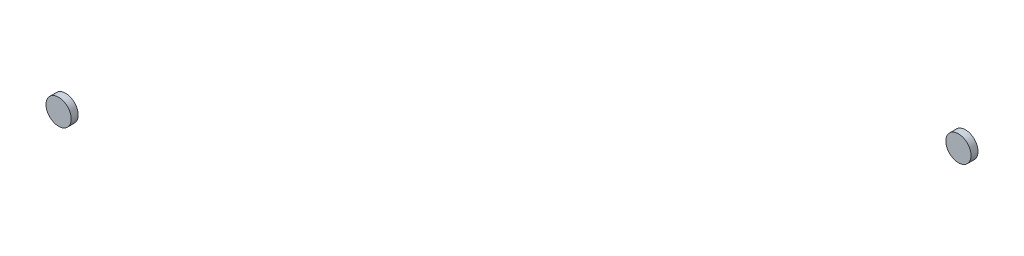
ISO-10303-21;
HEADER;
FILE_DESCRIPTION(('STEP AP214'),'2;1');
FILE_NAME('part.step','',(''),(''),'','','');
FILE_SCHEMA(('AUTOMOTIVE_DESIGN { 1 0 10303 214 1 1 1 1 }'));
ENDSEC;
DATA;
#1=APPLICATION_CONTEXT('core data for automotive mechanical design processes');
#2=APPLICATION_PROTOCOL_DEFINITION('international standard','automotive_design',2000,#1);
#3=PRODUCT_CONTEXT('',#1,'mechanical');
#4=PRODUCT('Part','Part','',(#3));
#5=PRODUCT_RELATED_PRODUCT_CATEGORY('part','',(#4));
#6=PRODUCT_DEFINITION_FORMATION('','',#4);
#7=PRODUCT_DEFINITION_CONTEXT('part definition',#1,'design');
#8=PRODUCT_DEFINITION('design','',#6,#7);
#9=PRODUCT_DEFINITION_SHAPE('','',#8);
#10=(LENGTH_UNIT() NAMED_UNIT(*) SI_UNIT(.MILLI.,.METRE.));
#11=(NAMED_UNIT(*) PLANE_ANGLE_UNIT() SI_UNIT($,.RADIAN.));
#12=(NAMED_UNIT(*) SI_UNIT($,.STERADIAN.) SOLID_ANGLE_UNIT());
#13=UNCERTAINTY_MEASURE_WITH_UNIT(LENGTH_MEASURE(1.E-05),#10,'distance_accuracy_value','');
#14=(GEOMETRIC_REPRESENTATION_CONTEXT(3) GLOBAL_UNCERTAINTY_ASSIGNED_CONTEXT((#13)) GLOBAL_UNIT_ASSIGNED_CONTEXT((#10,
#11,#12)) REPRESENTATION_CONTEXT('',''));
#15=CARTESIAN_POINT('',(0.,0.,0.));
#16=DIRECTION('',(0.,0.,1.));
#17=DIRECTION('',(1.,0.,0.));
#18=AXIS2_PLACEMENT_3D('',#15,#16,#17);
#19=CARTESIAN_POINT('',(8.67220214183972,22.0631646630226,-0.253998923289316));
#20=DIRECTION('',(0.,-8.74227339409095E-08,1.));
#21=DIRECTION('',(-1.19248806384999E-08,-1.,-8.74227339409095E-08));
#22=AXIS2_PLACEMENT_3D('',#19,#20,#21);
#23=PLANE('',#22);
#24=CARTESIAN_POINT('',(8.67220213638767,21.6059646630225,-0.253998963258991));
#25=DIRECTION('',(0.,8.74227339409095E-08,-1.));
#26=DIRECTION('',(1.19248806384999E-08,1.,8.74227339409095E-08));
#27=AXIS2_PLACEMENT_3D('',#24,#25,#26);
#28=CIRCLE('',#27,0.4572);
#29=CARTESIAN_POINT('',(8.67220214183973,22.0631646630226,-0.253998923289317));
#30=VERTEX_POINT('',#29);
#31=EDGE_CURVE('P0_E10',#30,#30,#28,.T.);
#32=ORIENTED_EDGE('',*,*,#31,.T.);
#33=EDGE_LOOP('',(#32));
#34=FACE_BOUND('',#33,.T.);
#35=ADVANCED_FACE('P0_F15',(#34),#23,.F.);
#36=CARTESIAN_POINT('',(8.67220214183972,22.0631646408171,1.07671068285201E-06));
#37=DIRECTION('',(0.,-8.74227339409095E-08,1.));
#38=DIRECTION('',(-1.19248806384999E-08,-1.,-8.74227339409095E-08));
#39=AXIS2_PLACEMENT_3D('',#36,#37,#38);
#40=PLANE('',#39);
#41=CARTESIAN_POINT('',(8.67220213638767,21.6059646408172,1.03674100901396E-06));
#42=DIRECTION('',(0.,8.74227339409095E-08,-1.));
#43=DIRECTION('',(1.19248806384999E-08,1.,8.74227339409095E-08));
#44=AXIS2_PLACEMENT_3D('',#41,#42,#43);
#45=CIRCLE('',#44,0.4572);
#46=CARTESIAN_POINT('',(8.67220214183973,22.0631646408172,1.07671068297175E-06));
#47=VERTEX_POINT('',#46);
#48=EDGE_CURVE('P0_E22',#47,#47,#45,.T.);
#49=ORIENTED_EDGE('',*,*,#48,.F.);
#50=EDGE_LOOP('',(#49));
#51=FACE_BOUND('',#50,.T.);
#52=ADVANCED_FACE('P0_F35',(#51),#40,.T.);
#53=CARTESIAN_POINT('',(8.67220213638767,21.6059646408172,1.03674100901396E-06));
#54=DIRECTION('',(0.,-8.74227339409095E-08,1.));
#55=DIRECTION('',(1.19248806384999E-08,1.,8.74227339409095E-08));
#56=AXIS2_PLACEMENT_3D('',#53,#54,#55);
#57=CYLINDRICAL_SURFACE('',#56,0.4572);
#58=ORIENTED_EDGE('',*,*,#31,.F.);
#59=EDGE_LOOP('',(#58));
#60=FACE_BOUND('',#59,.T.);
#61=ORIENTED_EDGE('',*,*,#48,.T.);
#62=EDGE_LOOP('',(#61));
#63=FACE_BOUND('',#62,.T.);
#64=ADVANCED_FACE('P0_F33',(#60,#63),#57,.T.);
#65=CLOSED_SHELL('',(#35,#52,#64));
#66=MANIFOLD_SOLID_BREP('P0_B1',#65);
#67=CARTESIAN_POINT('',(-24.4850024412425,6.40596775475197,-0.253998963258981));
#68=DIRECTION('',(0.,-8.74227339409092E-08,1.));
#69=DIRECTION('',(1.,-8.74227765734792E-08,0.));
#70=AXIS2_PLACEMENT_3D('',#67,#68,#69);
#71=PLANE('',#70);
#72=CARTESIAN_POINT('',(-24.0278024412425,6.40596771478227,-0.253998963258985));
#73=DIRECTION('',(0.,8.74227339409092E-08,-1.));
#74=DIRECTION('',(-1.,8.74227765734792E-08,0.));
#75=AXIS2_PLACEMENT_3D('',#72,#73,#74);
#76=CIRCLE('',#75,0.4572);
#77=CARTESIAN_POINT('',(-24.4850024412425,6.40596775475196,-0.253998963258982));
#78=VERTEX_POINT('',#77);
#79=EDGE_CURVE('P1_E10',#78,#78,#76,.T.);
#80=ORIENTED_EDGE('',*,*,#79,.T.);
#81=EDGE_LOOP('',(#80));
#82=FACE_BOUND('',#81,.T.);
#83=ADVANCED_FACE('P1_F15',(#82),#71,.F.);
#84=CARTESIAN_POINT('',(-24.4850024412425,6.40596773254659,1.0367410172539E-06));
#85=DIRECTION('',(0.,-8.74227339409092E-08,1.));
#86=DIRECTION('',(1.,-8.74227765734792E-08,0.));
#87=AXIS2_PLACEMENT_3D('',#84,#85,#86);
#88=PLANE('',#87);
#89=CARTESIAN_POINT('',(-24.0278024412425,6.4059676925769,1.03674101378445E-06));
#90=DIRECTION('',(0.,8.74227339409092E-08,-1.));
#91=DIRECTION('',(-1.,8.74227765734792E-08,0.));
#92=AXIS2_PLACEMENT_3D('',#89,#90,#91);
#93=CIRCLE('',#92,0.4572);
#94=CARTESIAN_POINT('',(-24.4850024412425,6.40596773254659,1.03674101727871E-06));
#95=VERTEX_POINT('',#94);
#96=EDGE_CURVE('P1_E22',#95,#95,#93,.T.);
#97=ORIENTED_EDGE('',*,*,#96,.F.);
#98=EDGE_LOOP('',(#97));
#99=FACE_BOUND('',#98,.T.);
#100=ADVANCED_FACE('P1_F35',(#99),#88,.T.);
#101=CARTESIAN_POINT('',(-24.0278024412425,6.4059676925769,1.03674101378445E-06));
#102=DIRECTION('',(0.,-8.74227339409092E-08,1.));
#103=DIRECTION('',(-1.,8.74227765734792E-08,0.));
#104=AXIS2_PLACEMENT_3D('',#101,#102,#103);
#105=CYLINDRICAL_SURFACE('',#104,0.4572);
#106=ORIENTED_EDGE('',*,*,#79,.F.);
#107=EDGE_LOOP('',(#106));
#108=FACE_BOUND('',#107,.T.);
#109=ORIENTED_EDGE('',*,*,#96,.T.);
#110=EDGE_LOOP('',(#109));
#111=FACE_BOUND('',#110,.T.);
#112=ADVANCED_FACE('P1_F33',(#108,#111),#105,.T.);
#113=CLOSED_SHELL('',(#83,#100,#112));
#114=MANIFOLD_SOLID_BREP('P1_B1',#113);
#115=ADVANCED_BREP_SHAPE_REPRESENTATION('',(#18,#66,#114),#14);
#116=SHAPE_DEFINITION_REPRESENTATION(#9,#115);
ENDSEC;
END-ISO-10303-21;
